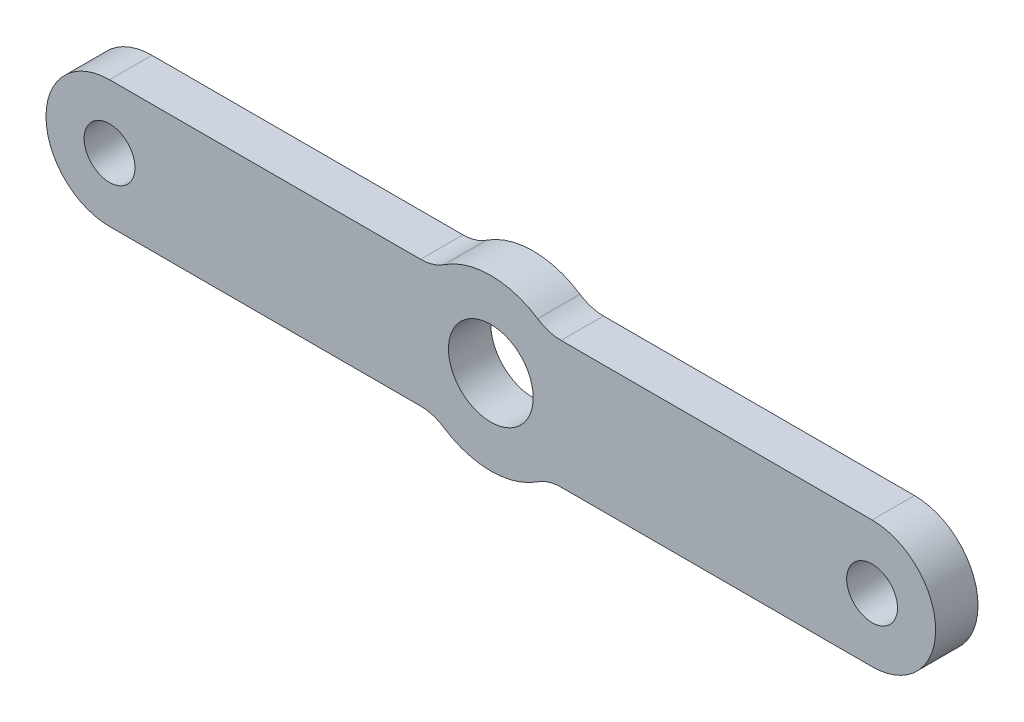
ISO-10303-21;
HEADER;
FILE_DESCRIPTION(('STEP AP214'),'2;1');
FILE_NAME('part.step','',(''),(''),'','','');
FILE_SCHEMA(('AUTOMOTIVE_DESIGN { 1 0 10303 214 1 1 1 1 }'));
ENDSEC;
DATA;
#1=APPLICATION_CONTEXT('core data for automotive mechanical design processes');
#2=APPLICATION_PROTOCOL_DEFINITION('international standard','automotive_design',2000,#1);
#3=PRODUCT_CONTEXT('',#1,'mechanical');
#4=PRODUCT('Part','Part','',(#3));
#5=PRODUCT_RELATED_PRODUCT_CATEGORY('part','',(#4));
#6=PRODUCT_DEFINITION_FORMATION('','',#4);
#7=PRODUCT_DEFINITION_CONTEXT('part definition',#1,'design');
#8=PRODUCT_DEFINITION('design','',#6,#7);
#9=PRODUCT_DEFINITION_SHAPE('','',#8);
#10=(LENGTH_UNIT() NAMED_UNIT(*) SI_UNIT(.MILLI.,.METRE.));
#11=(NAMED_UNIT(*) PLANE_ANGLE_UNIT() SI_UNIT($,.RADIAN.));
#12=(NAMED_UNIT(*) SI_UNIT($,.STERADIAN.) SOLID_ANGLE_UNIT());
#13=UNCERTAINTY_MEASURE_WITH_UNIT(LENGTH_MEASURE(1.E-05),#10,'distance_accuracy_value','');
#14=(GEOMETRIC_REPRESENTATION_CONTEXT(3) GLOBAL_UNCERTAINTY_ASSIGNED_CONTEXT((#13)) GLOBAL_UNIT_ASSIGNED_CONTEXT((#10,
#11,#12)) REPRESENTATION_CONTEXT('',''));
#15=CARTESIAN_POINT('',(0.,0.,0.));
#16=DIRECTION('',(0.,0.,1.));
#17=DIRECTION('',(1.,0.,0.));
#18=AXIS2_PLACEMENT_3D('',#15,#16,#17);
#19=CARTESIAN_POINT('',(-57.15,0.,6.35));
#20=DIRECTION('',(0.,0.,1.));
#21=DIRECTION('',(1.,0.,0.));
#22=AXIS2_PLACEMENT_3D('',#19,#20,#21);
#23=PLANE('',#22);
#24=CARTESIAN_POINT('',(57.15,0.,6.35));
#25=DIRECTION('',(0.,0.,1.));
#26=DIRECTION('',(1.,0.,0.));
#27=AXIS2_PLACEMENT_3D('',#24,#25,#26);
#28=CIRCLE('',#27,3.81);
#29=CARTESIAN_POINT('',(60.96,0.,6.35));
#30=VERTEX_POINT('',#29);
#31=EDGE_CURVE('E288',#30,#30,#28,.T.);
#32=ORIENTED_EDGE('',*,*,#31,.F.);
#33=EDGE_LOOP('',(#32));
#34=FACE_BOUND('',#33,.T.);
#35=CARTESIAN_POINT('',(-57.15,0.,6.35));
#36=DIRECTION('',(0.,0.,1.));
#37=DIRECTION('',(1.,0.,0.));
#38=AXIS2_PLACEMENT_3D('',#35,#36,#37);
#39=CIRCLE('',#38,9.525);
#40=CARTESIAN_POINT('',(-57.15,9.525,6.35));
#41=VERTEX_POINT('',#40);
#42=CARTESIAN_POINT('',(-57.15,-9.525,6.35));
#43=VERTEX_POINT('',#42);
#44=EDGE_CURVE('E179',#41,#43,#39,.T.);
#45=ORIENTED_EDGE('',*,*,#44,.T.);
#46=DIRECTION('',(1.,0.,0.));
#47=VECTOR('',#46,1.);
#48=CARTESIAN_POINT('',(-57.15,-9.525,6.35));
#49=LINE('',#48,#47);
#50=CARTESIAN_POINT('',(-10.5302837093784,-9.52500000000001,6.35));
#51=VERTEX_POINT('',#50);
#52=EDGE_CURVE('E107',#43,#51,#49,.T.);
#53=ORIENTED_EDGE('',*,*,#52,.T.);
#54=CARTESIAN_POINT('',(-10.5302837093784,-15.875,6.35));
#55=DIRECTION('',(0.,0.,-1.));
#56=DIRECTION('',(1.,0.,0.));
#57=AXIS2_PLACEMENT_3D('',#54,#55,#56);
#58=CIRCLE('',#57,6.35);
#59=CARTESIAN_POINT('',(-7.0201891395856,-10.5833333333333,6.35));
#60=VERTEX_POINT('',#59);
#61=EDGE_CURVE('E206',#51,#60,#58,.T.);
#62=ORIENTED_EDGE('',*,*,#61,.T.);
#63=CARTESIAN_POINT('',(0.,0.,6.35));
#64=DIRECTION('',(0.,0.,1.));
#65=DIRECTION('',(1.,0.,0.));
#66=AXIS2_PLACEMENT_3D('',#63,#64,#65);
#67=CIRCLE('',#66,12.7);
#68=CARTESIAN_POINT('',(7.02018913958559,-10.5833333333333,6.35));
#69=VERTEX_POINT('',#68);
#70=EDGE_CURVE('E225',#60,#69,#67,.T.);
#71=ORIENTED_EDGE('',*,*,#70,.T.);
#72=CARTESIAN_POINT('',(10.5302837093784,-15.875,6.35));
#73=DIRECTION('',(0.,0.,-1.));
#74=DIRECTION('',(-1.,0.,0.));
#75=AXIS2_PLACEMENT_3D('',#72,#73,#74);
#76=CIRCLE('',#75,6.35);
#77=CARTESIAN_POINT('',(10.5302837093784,-9.525,6.35));
#78=VERTEX_POINT('',#77);
#79=EDGE_CURVE('E222',#69,#78,#76,.T.);
#80=ORIENTED_EDGE('',*,*,#79,.T.);
#81=DIRECTION('',(1.,0.,0.));
#82=VECTOR('',#81,1.);
#83=CARTESIAN_POINT('',(10.5302837093784,-9.525,6.35));
#84=LINE('',#83,#82);
#85=CARTESIAN_POINT('',(57.15,-9.52500000000001,6.35));
#86=VERTEX_POINT('',#85);
#87=EDGE_CURVE('E224',#78,#86,#84,.T.);
#88=ORIENTED_EDGE('',*,*,#87,.T.);
#89=CARTESIAN_POINT('',(57.15,0.,6.35));
#90=DIRECTION('',(0.,0.,1.));
#91=DIRECTION('',(1.,0.,0.));
#92=AXIS2_PLACEMENT_3D('',#89,#90,#91);
#93=CIRCLE('',#92,9.52500000000001);
#94=CARTESIAN_POINT('',(57.15,9.52500000000001,6.35));
#95=VERTEX_POINT('',#94);
#96=EDGE_CURVE('E227',#86,#95,#93,.T.);
#97=ORIENTED_EDGE('',*,*,#96,.T.);
#98=DIRECTION('',(-1.,0.,0.));
#99=VECTOR('',#98,1.);
#100=CARTESIAN_POINT('',(10.5302837093784,9.525,6.35));
#101=LINE('',#100,#99);
#102=CARTESIAN_POINT('',(10.5302837093784,9.52500000000001,6.35));
#103=VERTEX_POINT('',#102);
#104=EDGE_CURVE('E233',#95,#103,#101,.T.);
#105=ORIENTED_EDGE('',*,*,#104,.T.);
#106=CARTESIAN_POINT('',(10.5302837093784,15.875,6.35));
#107=DIRECTION('',(0.,0.,-1.));
#108=DIRECTION('',(1.,0.,0.));
#109=AXIS2_PLACEMENT_3D('',#106,#107,#108);
#110=CIRCLE('',#109,6.35);
#111=CARTESIAN_POINT('',(7.02018913958559,10.5833333333333,6.35));
#112=VERTEX_POINT('',#111);
#113=EDGE_CURVE('E138',#103,#112,#110,.T.);
#114=ORIENTED_EDGE('',*,*,#113,.T.);
#115=CARTESIAN_POINT('',(0.,0.,6.35));
#116=DIRECTION('',(0.,0.,1.));
#117=DIRECTION('',(1.,0.,0.));
#118=AXIS2_PLACEMENT_3D('',#115,#116,#117);
#119=CIRCLE('',#118,12.7);
#120=CARTESIAN_POINT('',(-7.02018913958559,10.5833333333333,6.35));
#121=VERTEX_POINT('',#120);
#122=EDGE_CURVE('E132',#112,#121,#119,.T.);
#123=ORIENTED_EDGE('',*,*,#122,.T.);
#124=CARTESIAN_POINT('',(-10.5302837093784,15.875,6.35));
#125=DIRECTION('',(0.,0.,-1.));
#126=DIRECTION('',(1.,0.,0.));
#127=AXIS2_PLACEMENT_3D('',#124,#125,#126);
#128=CIRCLE('',#127,6.35);
#129=CARTESIAN_POINT('',(-10.5302837093784,9.525,6.35));
#130=VERTEX_POINT('',#129);
#131=EDGE_CURVE('E136',#121,#130,#128,.T.);
#132=ORIENTED_EDGE('',*,*,#131,.T.);
#133=DIRECTION('',(-1.,0.,0.));
#134=VECTOR('',#133,1.);
#135=CARTESIAN_POINT('',(-57.15,9.525,6.35));
#136=LINE('',#135,#134);
#137=EDGE_CURVE('E52',#130,#41,#136,.T.);
#138=ORIENTED_EDGE('',*,*,#137,.T.);
#139=EDGE_LOOP('',(#45,#53,#62,#71,#80,#88,#97,#105,#114,#123,#132,#138));
#140=FACE_BOUND('',#139,.T.);
#141=CARTESIAN_POINT('',(-57.15,0.,6.35));
#142=DIRECTION('',(0.,0.,1.));
#143=DIRECTION('',(1.,0.,0.));
#144=AXIS2_PLACEMENT_3D('',#141,#142,#143);
#145=CIRCLE('',#144,3.81);
#146=CARTESIAN_POINT('',(-53.34,0.,6.35));
#147=VERTEX_POINT('',#146);
#148=EDGE_CURVE('E160',#147,#147,#145,.T.);
#149=ORIENTED_EDGE('',*,*,#148,.F.);
#150=EDGE_LOOP('',(#149));
#151=FACE_BOUND('',#150,.T.);
#152=CARTESIAN_POINT('',(0.,0.,6.35));
#153=DIRECTION('',(0.,0.,1.));
#154=DIRECTION('',(1.,0.,0.));
#155=AXIS2_PLACEMENT_3D('',#152,#153,#154);
#156=CIRCLE('',#155,6.35);
#157=CARTESIAN_POINT('',(6.35,0.,6.35));
#158=VERTEX_POINT('',#157);
#159=EDGE_CURVE('E279',#158,#158,#156,.T.);
#160=ORIENTED_EDGE('',*,*,#159,.F.);
#161=EDGE_LOOP('',(#160));
#162=FACE_BOUND('',#161,.T.);
#163=ADVANCED_FACE('F35',(#34,#140,#151,#162),#23,.T.);
#164=CARTESIAN_POINT('',(-57.15,0.,0.));
#165=DIRECTION('',(0.,0.,1.));
#166=DIRECTION('',(1.,0.,0.));
#167=AXIS2_PLACEMENT_3D('',#164,#165,#166);
#168=PLANE('',#167);
#169=CARTESIAN_POINT('',(-57.15,0.,0.));
#170=DIRECTION('',(0.,0.,1.));
#171=DIRECTION('',(1.,0.,0.));
#172=AXIS2_PLACEMENT_3D('',#169,#170,#171);
#173=CIRCLE('',#172,9.525);
#174=CARTESIAN_POINT('',(-57.15,9.525,0.));
#175=VERTEX_POINT('',#174);
#176=CARTESIAN_POINT('',(-57.15,-9.525,0.));
#177=VERTEX_POINT('',#176);
#178=EDGE_CURVE('E156',#175,#177,#173,.T.);
#179=ORIENTED_EDGE('',*,*,#178,.F.);
#180=DIRECTION('',(-1.,0.,0.));
#181=VECTOR('',#180,1.);
#182=CARTESIAN_POINT('',(-57.15,9.525,0.));
#183=LINE('',#182,#181);
#184=CARTESIAN_POINT('',(-10.5302837093784,9.525,0.));
#185=VERTEX_POINT('',#184);
#186=EDGE_CURVE('E99',#185,#175,#183,.T.);
#187=ORIENTED_EDGE('',*,*,#186,.F.);
#188=CARTESIAN_POINT('',(-10.5302837093784,15.875,0.));
#189=DIRECTION('',(0.,0.,-1.));
#190=DIRECTION('',(1.,0.,0.));
#191=AXIS2_PLACEMENT_3D('',#188,#189,#190);
#192=CIRCLE('',#191,6.35);
#193=CARTESIAN_POINT('',(-7.02018913958559,10.5833333333333,0.));
#194=VERTEX_POINT('',#193);
#195=EDGE_CURVE('E93',#194,#185,#192,.T.);
#196=ORIENTED_EDGE('',*,*,#195,.F.);
#197=CARTESIAN_POINT('',(0.,0.,0.));
#198=DIRECTION('',(0.,0.,1.));
#199=DIRECTION('',(1.,0.,0.));
#200=AXIS2_PLACEMENT_3D('',#197,#198,#199);
#201=CIRCLE('',#200,12.7);
#202=CARTESIAN_POINT('',(7.02018913958559,10.5833333333333,0.));
#203=VERTEX_POINT('',#202);
#204=EDGE_CURVE('E146',#203,#194,#201,.T.);
#205=ORIENTED_EDGE('',*,*,#204,.F.);
#206=CARTESIAN_POINT('',(10.5302837093784,15.875,0.));
#207=DIRECTION('',(0.,0.,-1.));
#208=DIRECTION('',(1.,0.,0.));
#209=AXIS2_PLACEMENT_3D('',#206,#207,#208);
#210=CIRCLE('',#209,6.35);
#211=CARTESIAN_POINT('',(10.5302837093784,9.52500000000001,0.));
#212=VERTEX_POINT('',#211);
#213=EDGE_CURVE('E174',#212,#203,#210,.T.);
#214=ORIENTED_EDGE('',*,*,#213,.F.);
#215=DIRECTION('',(-1.,0.,0.));
#216=VECTOR('',#215,1.);
#217=CARTESIAN_POINT('',(10.5302837093784,9.525,0.));
#218=LINE('',#217,#216);
#219=CARTESIAN_POINT('',(57.15,9.52500000000001,0.));
#220=VERTEX_POINT('',#219);
#221=EDGE_CURVE('E172',#220,#212,#218,.T.);
#222=ORIENTED_EDGE('',*,*,#221,.F.);
#223=CARTESIAN_POINT('',(57.15,0.,0.));
#224=DIRECTION('',(0.,0.,1.));
#225=DIRECTION('',(1.,0.,0.));
#226=AXIS2_PLACEMENT_3D('',#223,#224,#225);
#227=CIRCLE('',#226,9.52500000000001);
#228=CARTESIAN_POINT('',(57.15,-9.52500000000001,0.));
#229=VERTEX_POINT('',#228);
#230=EDGE_CURVE('E170',#229,#220,#227,.T.);
#231=ORIENTED_EDGE('',*,*,#230,.F.);
#232=DIRECTION('',(1.,0.,0.));
#233=VECTOR('',#232,1.);
#234=CARTESIAN_POINT('',(10.5302837093784,-9.525,0.));
#235=LINE('',#234,#233);
#236=CARTESIAN_POINT('',(10.5302837093784,-9.525,0.));
#237=VERTEX_POINT('',#236);
#238=EDGE_CURVE('E168',#237,#229,#235,.T.);
#239=ORIENTED_EDGE('',*,*,#238,.F.);
#240=CARTESIAN_POINT('',(10.5302837093784,-15.875,0.));
#241=DIRECTION('',(0.,0.,-1.));
#242=DIRECTION('',(-1.,0.,0.));
#243=AXIS2_PLACEMENT_3D('',#240,#241,#242);
#244=CIRCLE('',#243,6.35);
#245=CARTESIAN_POINT('',(7.02018913958559,-10.5833333333333,0.));
#246=VERTEX_POINT('',#245);
#247=EDGE_CURVE('E166',#246,#237,#244,.T.);
#248=ORIENTED_EDGE('',*,*,#247,.F.);
#249=CARTESIAN_POINT('',(0.,0.,0.));
#250=DIRECTION('',(0.,0.,1.));
#251=DIRECTION('',(1.,0.,0.));
#252=AXIS2_PLACEMENT_3D('',#249,#250,#251);
#253=CIRCLE('',#252,12.7);
#254=CARTESIAN_POINT('',(-7.0201891395856,-10.5833333333333,0.));
#255=VERTEX_POINT('',#254);
#256=EDGE_CURVE('E164',#255,#246,#253,.T.);
#257=ORIENTED_EDGE('',*,*,#256,.F.);
#258=CARTESIAN_POINT('',(-10.5302837093784,-15.875,0.));
#259=DIRECTION('',(0.,0.,-1.));
#260=DIRECTION('',(1.,0.,0.));
#261=AXIS2_PLACEMENT_3D('',#258,#259,#260);
#262=CIRCLE('',#261,6.35);
#263=CARTESIAN_POINT('',(-10.5302837093784,-9.52500000000001,0.));
#264=VERTEX_POINT('',#263);
#265=EDGE_CURVE('E162',#264,#255,#262,.T.);
#266=ORIENTED_EDGE('',*,*,#265,.F.);
#267=DIRECTION('',(1.,0.,0.));
#268=VECTOR('',#267,1.);
#269=CARTESIAN_POINT('',(-57.15,-9.525,0.));
#270=LINE('',#269,#268);
#271=EDGE_CURVE('E159',#177,#264,#270,.T.);
#272=ORIENTED_EDGE('',*,*,#271,.F.);
#273=EDGE_LOOP('',(#179,#187,#196,#205,#214,#222,#231,#239,#248,#257,#266,#272));
#274=FACE_BOUND('',#273,.T.);
#275=CARTESIAN_POINT('',(-57.15,0.,0.));
#276=DIRECTION('',(0.,0.,1.));
#277=DIRECTION('',(1.,0.,0.));
#278=AXIS2_PLACEMENT_3D('',#275,#276,#277);
#279=CIRCLE('',#278,3.81);
#280=CARTESIAN_POINT('',(-53.34,0.,0.));
#281=VERTEX_POINT('',#280);
#282=EDGE_CURVE('E291',#281,#281,#279,.T.);
#283=ORIENTED_EDGE('',*,*,#282,.T.);
#284=EDGE_LOOP('',(#283));
#285=FACE_BOUND('',#284,.T.);
#286=CARTESIAN_POINT('',(57.15,0.,0.));
#287=DIRECTION('',(0.,0.,1.));
#288=DIRECTION('',(1.,0.,0.));
#289=AXIS2_PLACEMENT_3D('',#286,#287,#288);
#290=CIRCLE('',#289,3.81);
#291=CARTESIAN_POINT('',(60.96,0.,0.));
#292=VERTEX_POINT('',#291);
#293=EDGE_CURVE('E285',#292,#292,#290,.T.);
#294=ORIENTED_EDGE('',*,*,#293,.T.);
#295=EDGE_LOOP('',(#294));
#296=FACE_BOUND('',#295,.T.);
#297=CARTESIAN_POINT('',(0.,0.,0.));
#298=DIRECTION('',(0.,0.,1.));
#299=DIRECTION('',(1.,0.,0.));
#300=AXIS2_PLACEMENT_3D('',#297,#298,#299);
#301=CIRCLE('',#300,6.35);
#302=CARTESIAN_POINT('',(6.35,0.,0.));
#303=VERTEX_POINT('',#302);
#304=EDGE_CURVE('E282',#303,#303,#301,.T.);
#305=ORIENTED_EDGE('',*,*,#304,.T.);
#306=EDGE_LOOP('',(#305));
#307=FACE_BOUND('',#306,.T.);
#308=ADVANCED_FACE('F210',(#274,#285,#296,#307),#168,.F.);
#309=CARTESIAN_POINT('',(-57.15,0.,6.35));
#310=DIRECTION('',(0.,0.,-1.));
#311=DIRECTION('',(-1.,0.,0.));
#312=AXIS2_PLACEMENT_3D('',#309,#310,#311);
#313=CYLINDRICAL_SURFACE('',#312,9.525);
#314=ORIENTED_EDGE('',*,*,#178,.T.);
#315=DIRECTION('',(0.,0.,-1.));
#316=VECTOR('',#315,1.);
#317=CARTESIAN_POINT('',(-57.15,-9.525,6.35));
#318=LINE('',#317,#316);
#319=EDGE_CURVE('E11',#43,#177,#318,.T.);
#320=ORIENTED_EDGE('',*,*,#319,.F.);
#321=ORIENTED_EDGE('',*,*,#44,.F.);
#322=DIRECTION('',(0.,0.,-1.));
#323=VECTOR('',#322,1.);
#324=CARTESIAN_POINT('',(-57.15,9.525,6.35));
#325=LINE('',#324,#323);
#326=EDGE_CURVE('E152',#41,#175,#325,.T.);
#327=ORIENTED_EDGE('',*,*,#326,.T.);
#328=EDGE_LOOP('',(#314,#320,#321,#327));
#329=FACE_BOUND('',#328,.T.);
#330=ADVANCED_FACE('F37',(#329),#313,.T.);
#331=CARTESIAN_POINT('',(-57.15,-9.525,6.35));
#332=DIRECTION('',(0.,1.,0.));
#333=DIRECTION('',(-1.,0.,0.));
#334=AXIS2_PLACEMENT_3D('',#331,#332,#333);
#335=PLANE('',#334);
#336=ORIENTED_EDGE('',*,*,#271,.T.);
#337=DIRECTION('',(0.,0.,-1.));
#338=VECTOR('',#337,1.);
#339=CARTESIAN_POINT('',(-10.5302837093784,-9.52500000000001,6.35));
#340=LINE('',#339,#338);
#341=EDGE_CURVE('E44',#51,#264,#340,.T.);
#342=ORIENTED_EDGE('',*,*,#341,.F.);
#343=ORIENTED_EDGE('',*,*,#52,.F.);
#344=ORIENTED_EDGE('',*,*,#319,.T.);
#345=EDGE_LOOP('',(#336,#342,#343,#344));
#346=FACE_BOUND('',#345,.T.);
#347=ADVANCED_FACE('F393',(#346),#335,.F.);
#348=CARTESIAN_POINT('',(-10.5302837093784,-15.875,6.35));
#349=DIRECTION('',(0.,0.,-1.));
#350=DIRECTION('',(-1.,0.,0.));
#351=AXIS2_PLACEMENT_3D('',#348,#349,#350);
#352=CYLINDRICAL_SURFACE('',#351,6.35);
#353=ORIENTED_EDGE('',*,*,#265,.T.);
#354=DIRECTION('',(0.,0.,-1.));
#355=VECTOR('',#354,1.);
#356=CARTESIAN_POINT('',(-7.0201891395856,-10.5833333333333,6.35));
#357=LINE('',#356,#355);
#358=EDGE_CURVE('E198',#60,#255,#357,.T.);
#359=ORIENTED_EDGE('',*,*,#358,.F.);
#360=ORIENTED_EDGE('',*,*,#61,.F.);
#361=ORIENTED_EDGE('',*,*,#341,.T.);
#362=EDGE_LOOP('',(#353,#359,#360,#361));
#363=FACE_BOUND('',#362,.T.);
#364=ADVANCED_FACE('F204',(#363),#352,.F.);
#365=CARTESIAN_POINT('',(0.,0.,6.35));
#366=DIRECTION('',(0.,0.,-1.));
#367=DIRECTION('',(-1.,0.,0.));
#368=AXIS2_PLACEMENT_3D('',#365,#366,#367);
#369=CYLINDRICAL_SURFACE('',#368,12.7);
#370=ORIENTED_EDGE('',*,*,#256,.T.);
#371=DIRECTION('',(0.,0.,-1.));
#372=VECTOR('',#371,1.);
#373=CARTESIAN_POINT('',(7.02018913958559,-10.5833333333333,6.35));
#374=LINE('',#373,#372);
#375=EDGE_CURVE('E195',#69,#246,#374,.T.);
#376=ORIENTED_EDGE('',*,*,#375,.F.);
#377=ORIENTED_EDGE('',*,*,#70,.F.);
#378=ORIENTED_EDGE('',*,*,#358,.T.);
#379=EDGE_LOOP('',(#370,#376,#377,#378));
#380=FACE_BOUND('',#379,.T.);
#381=ADVANCED_FACE('F216',(#380),#369,.T.);
#382=CARTESIAN_POINT('',(10.5302837093784,-15.875,6.35));
#383=DIRECTION('',(0.,0.,-1.));
#384=DIRECTION('',(-1.,0.,0.));
#385=AXIS2_PLACEMENT_3D('',#382,#383,#384);
#386=CYLINDRICAL_SURFACE('',#385,6.35);
#387=ORIENTED_EDGE('',*,*,#247,.T.);
#388=DIRECTION('',(0.,0.,-1.));
#389=VECTOR('',#388,1.);
#390=CARTESIAN_POINT('',(10.5302837093784,-9.525,6.35));
#391=LINE('',#390,#389);
#392=EDGE_CURVE('E192',#78,#237,#391,.T.);
#393=ORIENTED_EDGE('',*,*,#392,.F.);
#394=ORIENTED_EDGE('',*,*,#79,.F.);
#395=ORIENTED_EDGE('',*,*,#375,.T.);
#396=EDGE_LOOP('',(#387,#393,#394,#395));
#397=FACE_BOUND('',#396,.T.);
#398=ADVANCED_FACE('F220',(#397),#386,.F.);
#399=CARTESIAN_POINT('',(10.5302837093784,-9.525,6.35));
#400=DIRECTION('',(0.,1.,0.));
#401=DIRECTION('',(-1.,0.,0.));
#402=AXIS2_PLACEMENT_3D('',#399,#400,#401);
#403=PLANE('',#402);
#404=ORIENTED_EDGE('',*,*,#238,.T.);
#405=DIRECTION('',(0.,0.,-1.));
#406=VECTOR('',#405,1.);
#407=CARTESIAN_POINT('',(57.15,-9.52500000000001,6.35));
#408=LINE('',#407,#406);
#409=EDGE_CURVE('E189',#86,#229,#408,.T.);
#410=ORIENTED_EDGE('',*,*,#409,.F.);
#411=ORIENTED_EDGE('',*,*,#87,.F.);
#412=ORIENTED_EDGE('',*,*,#392,.T.);
#413=EDGE_LOOP('',(#404,#410,#411,#412));
#414=FACE_BOUND('',#413,.T.);
#415=ADVANCED_FACE('F358',(#414),#403,.F.);
#416=CARTESIAN_POINT('',(57.15,0.,6.35));
#417=DIRECTION('',(0.,0.,-1.));
#418=DIRECTION('',(-1.,0.,0.));
#419=AXIS2_PLACEMENT_3D('',#416,#417,#418);
#420=CYLINDRICAL_SURFACE('',#419,9.52500000000001);
#421=ORIENTED_EDGE('',*,*,#230,.T.);
#422=DIRECTION('',(0.,0.,-1.));
#423=VECTOR('',#422,1.);
#424=CARTESIAN_POINT('',(57.15,9.52500000000001,6.35));
#425=LINE('',#424,#423);
#426=EDGE_CURVE('E186',#95,#220,#425,.T.);
#427=ORIENTED_EDGE('',*,*,#426,.F.);
#428=ORIENTED_EDGE('',*,*,#96,.F.);
#429=ORIENTED_EDGE('',*,*,#409,.T.);
#430=EDGE_LOOP('',(#421,#427,#428,#429));
#431=FACE_BOUND('',#430,.T.);
#432=ADVANCED_FACE('F349',(#431),#420,.T.);
#433=CARTESIAN_POINT('',(10.5302837093784,9.525,6.35));
#434=DIRECTION('',(0.,-1.,0.));
#435=DIRECTION('',(1.,0.,0.));
#436=AXIS2_PLACEMENT_3D('',#433,#434,#435);
#437=PLANE('',#436);
#438=ORIENTED_EDGE('',*,*,#221,.T.);
#439=DIRECTION('',(0.,0.,-1.));
#440=VECTOR('',#439,1.);
#441=CARTESIAN_POINT('',(10.5302837093784,9.52500000000001,6.35));
#442=LINE('',#441,#440);
#443=EDGE_CURVE('E183',#103,#212,#442,.T.);
#444=ORIENTED_EDGE('',*,*,#443,.F.);
#445=ORIENTED_EDGE('',*,*,#104,.F.);
#446=ORIENTED_EDGE('',*,*,#426,.T.);
#447=EDGE_LOOP('',(#438,#444,#445,#446));
#448=FACE_BOUND('',#447,.T.);
#449=ADVANCED_FACE('F239',(#448),#437,.F.);
#450=CARTESIAN_POINT('',(10.5302837093784,15.875,6.35));
#451=DIRECTION('',(0.,0.,-1.));
#452=DIRECTION('',(-1.,0.,0.));
#453=AXIS2_PLACEMENT_3D('',#450,#451,#452);
#454=CYLINDRICAL_SURFACE('',#453,6.35);
#455=ORIENTED_EDGE('',*,*,#213,.T.);
#456=DIRECTION('',(0.,0.,-1.));
#457=VECTOR('',#456,1.);
#458=CARTESIAN_POINT('',(7.02018913958559,10.5833333333333,6.35));
#459=LINE('',#458,#457);
#460=EDGE_CURVE('E147',#112,#203,#459,.T.);
#461=ORIENTED_EDGE('',*,*,#460,.F.);
#462=ORIENTED_EDGE('',*,*,#113,.F.);
#463=ORIENTED_EDGE('',*,*,#443,.T.);
#464=EDGE_LOOP('',(#455,#461,#462,#463));
#465=FACE_BOUND('',#464,.T.);
#466=ADVANCED_FACE('F243',(#465),#454,.F.);
#467=CARTESIAN_POINT('',(0.,0.,6.35));
#468=DIRECTION('',(0.,0.,-1.));
#469=DIRECTION('',(-1.,0.,0.));
#470=AXIS2_PLACEMENT_3D('',#467,#468,#469);
#471=CYLINDRICAL_SURFACE('',#470,12.7);
#472=ORIENTED_EDGE('',*,*,#204,.T.);
#473=DIRECTION('',(0.,0.,-1.));
#474=VECTOR('',#473,1.);
#475=CARTESIAN_POINT('',(-7.02018913958559,10.5833333333333,6.35));
#476=LINE('',#475,#474);
#477=EDGE_CURVE('E143',#121,#194,#476,.T.);
#478=ORIENTED_EDGE('',*,*,#477,.F.);
#479=ORIENTED_EDGE('',*,*,#122,.F.);
#480=ORIENTED_EDGE('',*,*,#460,.T.);
#481=EDGE_LOOP('',(#472,#478,#479,#480));
#482=FACE_BOUND('',#481,.T.);
#483=ADVANCED_FACE('F144',(#482),#471,.T.);
#484=CARTESIAN_POINT('',(-10.5302837093784,15.875,6.35));
#485=DIRECTION('',(0.,0.,-1.));
#486=DIRECTION('',(-1.,0.,0.));
#487=AXIS2_PLACEMENT_3D('',#484,#485,#486);
#488=CYLINDRICAL_SURFACE('',#487,6.35);
#489=ORIENTED_EDGE('',*,*,#195,.T.);
#490=DIRECTION('',(0.,0.,-1.));
#491=VECTOR('',#490,1.);
#492=CARTESIAN_POINT('',(-10.5302837093784,9.525,6.35));
#493=LINE('',#492,#491);
#494=EDGE_CURVE('E148',#130,#185,#493,.T.);
#495=ORIENTED_EDGE('',*,*,#494,.F.);
#496=ORIENTED_EDGE('',*,*,#131,.F.);
#497=ORIENTED_EDGE('',*,*,#477,.T.);
#498=EDGE_LOOP('',(#489,#495,#496,#497));
#499=FACE_BOUND('',#498,.T.);
#500=ADVANCED_FACE('F150',(#499),#488,.F.);
#501=CARTESIAN_POINT('',(-57.15,9.525,6.35));
#502=DIRECTION('',(0.,-1.,0.));
#503=DIRECTION('',(1.,0.,0.));
#504=AXIS2_PLACEMENT_3D('',#501,#502,#503);
#505=PLANE('',#504);
#506=ORIENTED_EDGE('',*,*,#186,.T.);
#507=ORIENTED_EDGE('',*,*,#326,.F.);
#508=ORIENTED_EDGE('',*,*,#137,.F.);
#509=ORIENTED_EDGE('',*,*,#494,.T.);
#510=EDGE_LOOP('',(#506,#507,#508,#509));
#511=FACE_BOUND('',#510,.T.);
#512=ADVANCED_FACE('F247',(#511),#505,.F.);
#513=CARTESIAN_POINT('',(-57.15,0.,6.35));
#514=DIRECTION('',(0.,0.,-1.));
#515=DIRECTION('',(-1.,0.,0.));
#516=AXIS2_PLACEMENT_3D('',#513,#514,#515);
#517=CYLINDRICAL_SURFACE('',#516,3.81);
#518=ORIENTED_EDGE('',*,*,#148,.T.);
#519=EDGE_LOOP('',(#518));
#520=FACE_BOUND('',#519,.T.);
#521=ORIENTED_EDGE('',*,*,#282,.F.);
#522=EDGE_LOOP('',(#521));
#523=FACE_BOUND('',#522,.T.);
#524=ADVANCED_FACE('F249',(#520,#523),#517,.F.);
#525=CARTESIAN_POINT('',(57.15,0.,6.35));
#526=DIRECTION('',(0.,0.,-1.));
#527=DIRECTION('',(-1.,0.,0.));
#528=AXIS2_PLACEMENT_3D('',#525,#526,#527);
#529=CYLINDRICAL_SURFACE('',#528,3.81);
#530=ORIENTED_EDGE('',*,*,#31,.T.);
#531=EDGE_LOOP('',(#530));
#532=FACE_BOUND('',#531,.T.);
#533=ORIENTED_EDGE('',*,*,#293,.F.);
#534=EDGE_LOOP('',(#533));
#535=FACE_BOUND('',#534,.T.);
#536=ADVANCED_FACE('F255',(#532,#535),#529,.F.);
#537=CARTESIAN_POINT('',(0.,0.,6.35));
#538=DIRECTION('',(0.,0.,-1.));
#539=DIRECTION('',(-1.,0.,0.));
#540=AXIS2_PLACEMENT_3D('',#537,#538,#539);
#541=CYLINDRICAL_SURFACE('',#540,6.35);
#542=ORIENTED_EDGE('',*,*,#159,.T.);
#543=EDGE_LOOP('',(#542));
#544=FACE_BOUND('',#543,.T.);
#545=ORIENTED_EDGE('',*,*,#304,.F.);
#546=EDGE_LOOP('',(#545));
#547=FACE_BOUND('',#546,.T.);
#548=ADVANCED_FACE('F270',(#544,#547),#541,.F.);
#549=CLOSED_SHELL('',(#163,#308,#330,#347,#364,#381,#398,#415,#432,#449,#466,#483,#500,#512,
#524,#536,#548));
#550=MANIFOLD_SOLID_BREP('B2',#549);
#551=ADVANCED_BREP_SHAPE_REPRESENTATION('',(#18,#550),#14);
#552=SHAPE_DEFINITION_REPRESENTATION(#9,#551);
ENDSEC;
END-ISO-10303-21;
